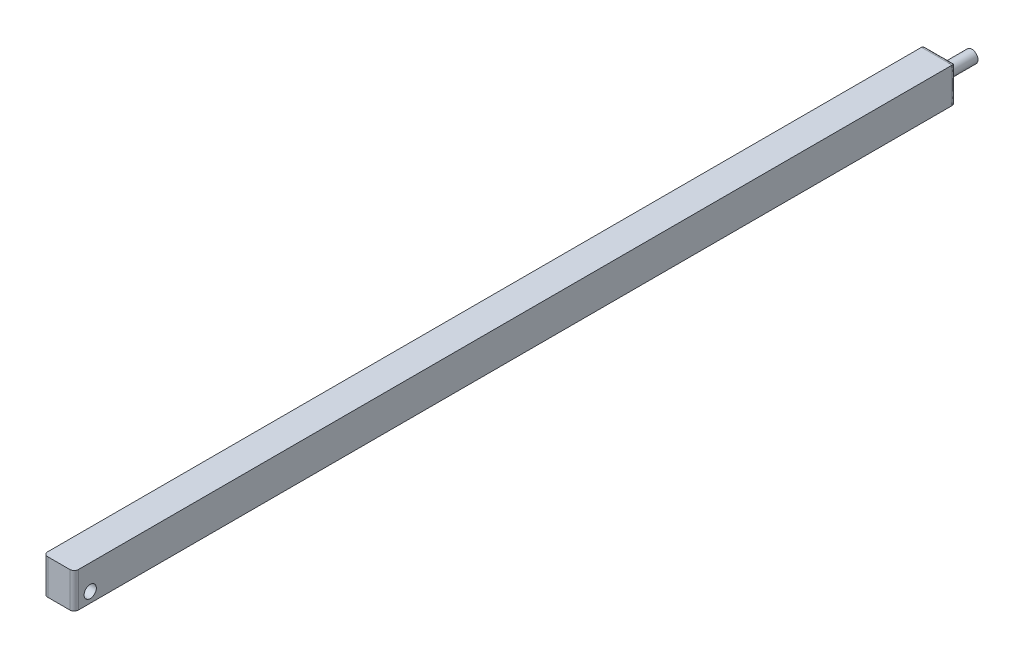
ISO-10303-21;
HEADER;
FILE_DESCRIPTION(('STEP AP214'),'2;1');
FILE_NAME('part.step','',(''),(''),'','','');
FILE_SCHEMA(('AUTOMOTIVE_DESIGN { 1 0 10303 214 1 1 1 1 }'));
ENDSEC;
DATA;
#1=APPLICATION_CONTEXT('core data for automotive mechanical design processes');
#2=APPLICATION_PROTOCOL_DEFINITION('international standard','automotive_design',2000,#1);
#3=PRODUCT_CONTEXT('',#1,'mechanical');
#4=PRODUCT('Part','Part','',(#3));
#5=PRODUCT_RELATED_PRODUCT_CATEGORY('part','',(#4));
#6=PRODUCT_DEFINITION_FORMATION('','',#4);
#7=PRODUCT_DEFINITION_CONTEXT('part definition',#1,'design');
#8=PRODUCT_DEFINITION('design','',#6,#7);
#9=PRODUCT_DEFINITION_SHAPE('','',#8);
#10=(LENGTH_UNIT() NAMED_UNIT(*) SI_UNIT(.MILLI.,.METRE.));
#11=(NAMED_UNIT(*) PLANE_ANGLE_UNIT() SI_UNIT($,.RADIAN.));
#12=(NAMED_UNIT(*) SI_UNIT($,.STERADIAN.) SOLID_ANGLE_UNIT());
#13=UNCERTAINTY_MEASURE_WITH_UNIT(LENGTH_MEASURE(1.E-05),#10,'distance_accuracy_value','');
#14=(GEOMETRIC_REPRESENTATION_CONTEXT(3) GLOBAL_UNCERTAINTY_ASSIGNED_CONTEXT((#13)) GLOBAL_UNIT_ASSIGNED_CONTEXT((#10,
#11,#12)) REPRESENTATION_CONTEXT('',''));
#15=CARTESIAN_POINT('',(0.,0.,0.));
#16=DIRECTION('',(0.,0.,1.));
#17=DIRECTION('',(1.,0.,0.));
#18=AXIS2_PLACEMENT_3D('',#15,#16,#17);
#19=CARTESIAN_POINT('',(0.,0.,1000.));
#20=DIRECTION('',(-1.,0.,0.));
#21=DIRECTION('',(0.,0.,1.));
#22=AXIS2_PLACEMENT_3D('',#19,#20,#21);
#23=PLANE('',#22);
#24=CARTESIAN_POINT('',(0.,11.6,981.7));
#25=DIRECTION('',(-1.,0.,0.));
#26=DIRECTION('',(0.,0.,1.));
#27=AXIS2_PLACEMENT_3D('',#24,#25,#26);
#28=CIRCLE('',#27,7.00000000000004);
#29=CARTESIAN_POINT('',(0.,11.6,974.7));
#30=VERTEX_POINT('',#29);
#31=EDGE_CURVE('E225',#30,#30,#28,.T.);
#32=ORIENTED_EDGE('',*,*,#31,.T.);
#33=EDGE_LOOP('',(#32));
#34=FACE_BOUND('',#33,.T.);
#35=DIRECTION('',(0.,0.,-1.));
#36=VECTOR('',#35,1.);
#37=CARTESIAN_POINT('',(0.,40.,1000.));
#38=LINE('',#37,#36);
#39=CARTESIAN_POINT('',(0.,40.,995.));
#40=VERTEX_POINT('',#39);
#41=CARTESIAN_POINT('',(0.,40.,0.));
#42=VERTEX_POINT('',#41);
#43=EDGE_CURVE('E221',#40,#42,#38,.T.);
#44=ORIENTED_EDGE('',*,*,#43,.F.);
#45=DIRECTION('',(0.,1.,0.));
#46=VECTOR('',#45,1.);
#47=CARTESIAN_POINT('',(0.,0.,995.));
#48=LINE('',#47,#46);
#49=CARTESIAN_POINT('',(0.,0.,995.));
#50=VERTEX_POINT('',#49);
#51=EDGE_CURVE('E12',#40,#50,#48,.F.);
#52=ORIENTED_EDGE('',*,*,#51,.T.);
#53=DIRECTION('',(0.,0.,-1.));
#54=VECTOR('',#53,1.);
#55=CARTESIAN_POINT('',(0.,0.,1000.));
#56=LINE('',#55,#54);
#57=CARTESIAN_POINT('',(0.,0.,0.));
#58=VERTEX_POINT('',#57);
#59=EDGE_CURVE('E210',#50,#58,#56,.T.);
#60=ORIENTED_EDGE('',*,*,#59,.T.);
#61=DIRECTION('',(0.,1.,0.));
#62=VECTOR('',#61,1.);
#63=CARTESIAN_POINT('',(0.,0.,0.));
#64=LINE('',#63,#62);
#65=EDGE_CURVE('E218',#58,#42,#64,.T.);
#66=ORIENTED_EDGE('',*,*,#65,.T.);
#67=EDGE_LOOP('',(#44,#52,#60,#66));
#68=FACE_BOUND('',#67,.T.);
#69=ADVANCED_FACE('F134',(#34,#68),#23,.F.);
#70=CARTESIAN_POINT('',(0.,40.,1000.));
#71=DIRECTION('',(0.,-1.,0.));
#72=DIRECTION('',(1.,0.,0.));
#73=AXIS2_PLACEMENT_3D('',#70,#71,#72);
#74=PLANE('',#73);
#75=DIRECTION('',(0.,0.,-1.));
#76=VECTOR('',#75,1.);
#77=CARTESIAN_POINT('',(-35.,40.,1000.));
#78=LINE('',#77,#76);
#79=CARTESIAN_POINT('',(-35.,40.,995.));
#80=VERTEX_POINT('',#79);
#81=CARTESIAN_POINT('',(-35.,40.,0.));
#82=VERTEX_POINT('',#81);
#83=EDGE_CURVE('E209',#80,#82,#78,.T.);
#84=ORIENTED_EDGE('',*,*,#83,.F.);
#85=CARTESIAN_POINT('',(-30.,40.,995.));
#86=DIRECTION('',(0.,-1.,0.));
#87=DIRECTION('',(1.,0.,0.));
#88=AXIS2_PLACEMENT_3D('',#85,#86,#87);
#89=CIRCLE('',#88,5.);
#90=CARTESIAN_POINT('',(-30.,40.,1000.));
#91=VERTEX_POINT('',#90);
#92=EDGE_CURVE('E145',#80,#91,#89,.F.);
#93=ORIENTED_EDGE('',*,*,#92,.T.);
#94=DIRECTION('',(-1.,0.,0.));
#95=VECTOR('',#94,1.);
#96=CARTESIAN_POINT('',(0.,40.,1000.));
#97=LINE('',#96,#95);
#98=CARTESIAN_POINT('',(-5.,40.,1000.));
#99=VERTEX_POINT('',#98);
#100=EDGE_CURVE('E186',#99,#91,#97,.T.);
#101=ORIENTED_EDGE('',*,*,#100,.F.);
#102=CARTESIAN_POINT('',(-5.,40.,995.));
#103=DIRECTION('',(0.,-1.,0.));
#104=DIRECTION('',(1.,0.,0.));
#105=AXIS2_PLACEMENT_3D('',#102,#103,#104);
#106=CIRCLE('',#105,5.);
#107=EDGE_CURVE('E154',#99,#40,#106,.F.);
#108=ORIENTED_EDGE('',*,*,#107,.T.);
#109=ORIENTED_EDGE('',*,*,#43,.T.);
#110=DIRECTION('',(1.,0.,0.));
#111=VECTOR('',#110,1.);
#112=CARTESIAN_POINT('',(0.,40.,0.));
#113=LINE('',#112,#111);
#114=EDGE_CURVE('E216',#42,#82,#113,.F.);
#115=ORIENTED_EDGE('',*,*,#114,.T.);
#116=EDGE_LOOP('',(#84,#93,#101,#108,#109,#115));
#117=FACE_BOUND('',#116,.T.);
#118=ADVANCED_FACE('F423',(#117),#74,.F.);
#119=CARTESIAN_POINT('',(-35.,0.,1000.));
#120=DIRECTION('',(1.,0.,0.));
#121=DIRECTION('',(0.,0.,-1.));
#122=AXIS2_PLACEMENT_3D('',#119,#120,#121);
#123=PLANE('',#122);
#124=CARTESIAN_POINT('',(-35.,11.6,981.7));
#125=DIRECTION('',(1.,0.,0.));
#126=DIRECTION('',(0.,0.,-1.));
#127=AXIS2_PLACEMENT_3D('',#124,#125,#126);
#128=CIRCLE('',#127,7.00000000000004);
#129=CARTESIAN_POINT('',(-35.,11.6,974.7));
#130=VERTEX_POINT('',#129);
#131=EDGE_CURVE('E412',#130,#130,#128,.T.);
#132=ORIENTED_EDGE('',*,*,#131,.T.);
#133=EDGE_LOOP('',(#132));
#134=FACE_BOUND('',#133,.T.);
#135=DIRECTION('',(0.,0.,-1.));
#136=VECTOR('',#135,1.);
#137=CARTESIAN_POINT('',(-35.,0.,1000.));
#138=LINE('',#137,#136);
#139=CARTESIAN_POINT('',(-35.,0.,995.));
#140=VERTEX_POINT('',#139);
#141=CARTESIAN_POINT('',(-35.,0.,0.));
#142=VERTEX_POINT('',#141);
#143=EDGE_CURVE('E202',#140,#142,#138,.T.);
#144=ORIENTED_EDGE('',*,*,#143,.F.);
#145=DIRECTION('',(0.,-1.,0.));
#146=VECTOR('',#145,1.);
#147=CARTESIAN_POINT('',(-35.,40.,995.));
#148=LINE('',#147,#146);
#149=EDGE_CURVE('E397',#140,#80,#148,.F.);
#150=ORIENTED_EDGE('',*,*,#149,.T.);
#151=ORIENTED_EDGE('',*,*,#83,.T.);
#152=DIRECTION('',(0.,1.,0.));
#153=VECTOR('',#152,1.);
#154=CARTESIAN_POINT('',(-35.,0.,0.));
#155=LINE('',#154,#153);
#156=EDGE_CURVE('E187',#82,#142,#155,.F.);
#157=ORIENTED_EDGE('',*,*,#156,.T.);
#158=EDGE_LOOP('',(#144,#150,#151,#157));
#159=FACE_BOUND('',#158,.T.);
#160=ADVANCED_FACE('F213',(#134,#159),#123,.F.);
#161=CARTESIAN_POINT('',(-35.,0.,1000.));
#162=DIRECTION('',(0.,1.,0.));
#163=DIRECTION('',(0.,0.,1.));
#164=AXIS2_PLACEMENT_3D('',#161,#162,#163);
#165=PLANE('',#164);
#166=DIRECTION('',(1.,0.,0.));
#167=VECTOR('',#166,1.);
#168=CARTESIAN_POINT('',(-35.,0.,1000.));
#169=LINE('',#168,#167);
#170=CARTESIAN_POINT('',(-30.,0.,1000.));
#171=VERTEX_POINT('',#170);
#172=CARTESIAN_POINT('',(-5.,0.,1000.));
#173=VERTEX_POINT('',#172);
#174=EDGE_CURVE('E390',#171,#173,#169,.T.);
#175=ORIENTED_EDGE('',*,*,#174,.F.);
#176=CARTESIAN_POINT('',(-30.,0.,995.));
#177=DIRECTION('',(0.,1.,0.));
#178=DIRECTION('',(0.,0.,1.));
#179=AXIS2_PLACEMENT_3D('',#176,#177,#178);
#180=CIRCLE('',#179,5.);
#181=EDGE_CURVE('E206',#171,#140,#180,.F.);
#182=ORIENTED_EDGE('',*,*,#181,.T.);
#183=ORIENTED_EDGE('',*,*,#143,.T.);
#184=DIRECTION('',(1.,0.,0.));
#185=VECTOR('',#184,1.);
#186=CARTESIAN_POINT('',(-35.,0.,0.));
#187=LINE('',#186,#185);
#188=EDGE_CURVE('E173',#142,#58,#187,.T.);
#189=ORIENTED_EDGE('',*,*,#188,.T.);
#190=ORIENTED_EDGE('',*,*,#59,.F.);
#191=CARTESIAN_POINT('',(-5.,0.,995.));
#192=DIRECTION('',(0.,1.,0.));
#193=DIRECTION('',(0.,0.,1.));
#194=AXIS2_PLACEMENT_3D('',#191,#192,#193);
#195=CIRCLE('',#194,5.);
#196=EDGE_CURVE('E388',#50,#173,#195,.F.);
#197=ORIENTED_EDGE('',*,*,#196,.T.);
#198=EDGE_LOOP('',(#175,#182,#183,#189,#190,#197));
#199=FACE_BOUND('',#198,.T.);
#200=ADVANCED_FACE('F204',(#199),#165,.F.);
#201=CARTESIAN_POINT('',(0.,0.,1000.));
#202=DIRECTION('',(0.,0.,1.));
#203=DIRECTION('',(1.,0.,0.));
#204=AXIS2_PLACEMENT_3D('',#201,#202,#203);
#205=PLANE('',#204);
#206=ORIENTED_EDGE('',*,*,#100,.T.);
#207=DIRECTION('',(0.,-1.,0.));
#208=VECTOR('',#207,1.);
#209=CARTESIAN_POINT('',(-30.,0.,1000.));
#210=LINE('',#209,#208);
#211=EDGE_CURVE('E395',#91,#171,#210,.T.);
#212=ORIENTED_EDGE('',*,*,#211,.T.);
#213=ORIENTED_EDGE('',*,*,#174,.T.);
#214=DIRECTION('',(0.,1.,0.));
#215=VECTOR('',#214,1.);
#216=CARTESIAN_POINT('',(-5.,40.,1000.));
#217=LINE('',#216,#215);
#218=EDGE_CURVE('E394',#173,#99,#217,.T.);
#219=ORIENTED_EDGE('',*,*,#218,.T.);
#220=EDGE_LOOP('',(#206,#212,#213,#219));
#221=FACE_BOUND('',#220,.T.);
#222=ADVANCED_FACE('F428',(#221),#205,.T.);
#223=CARTESIAN_POINT('',(-35.,11.6,981.7));
#224=DIRECTION('',(1.,0.,0.));
#225=DIRECTION('',(0.,0.,-1.));
#226=AXIS2_PLACEMENT_3D('',#223,#224,#225);
#227=CYLINDRICAL_SURFACE('',#226,7.00000000000004);
#228=CARTESIAN_POINT('',(-35.,11.6,974.7));
#229=CARTESIAN_POINT('',(-34.6354166666667,11.6,974.7));
#230=CARTESIAN_POINT('',(-34.2708333333333,11.6,974.7));
#231=CARTESIAN_POINT('',(-33.5416666666667,11.6,974.7));
#232=CARTESIAN_POINT('',(-33.1770833333333,11.6,974.7));
#233=CARTESIAN_POINT('',(-32.4479166666667,11.6,974.7));
#234=CARTESIAN_POINT('',(-32.0833333333333,11.6,974.7));
#235=CARTESIAN_POINT('',(-31.3541666666667,11.6,974.7));
#236=CARTESIAN_POINT('',(-30.9895833333333,11.6,974.7));
#237=CARTESIAN_POINT('',(-30.2604166666667,11.6,974.7));
#238=CARTESIAN_POINT('',(-29.8958333333333,11.6,974.7));
#239=CARTESIAN_POINT('',(-29.1666666666667,11.6,974.7));
#240=CARTESIAN_POINT('',(-28.8020833333333,11.6,974.7));
#241=CARTESIAN_POINT('',(-28.0729166666667,11.6,974.7));
#242=CARTESIAN_POINT('',(-27.7083333333333,11.6,974.7));
#243=CARTESIAN_POINT('',(-26.9791666666667,11.6,974.7));
#244=CARTESIAN_POINT('',(-26.6145833333333,11.6,974.7));
#245=CARTESIAN_POINT('',(-25.8854166666667,11.6,974.7));
#246=CARTESIAN_POINT('',(-25.5208333333333,11.6,974.7));
#247=CARTESIAN_POINT('',(-24.7916666666667,11.6,974.7));
#248=CARTESIAN_POINT('',(-24.4270833333333,11.6,974.7));
#249=CARTESIAN_POINT('',(-23.6979166666667,11.6,974.7));
#250=CARTESIAN_POINT('',(-23.3333333333333,11.6,974.7));
#251=CARTESIAN_POINT('',(-22.6041666666667,11.6,974.7));
#252=CARTESIAN_POINT('',(-22.2395833333333,11.6,974.7));
#253=CARTESIAN_POINT('',(-21.5104166666667,11.6,974.7));
#254=CARTESIAN_POINT('',(-21.1458333333333,11.6,974.7));
#255=CARTESIAN_POINT('',(-20.4166666666667,11.6,974.7));
#256=CARTESIAN_POINT('',(-20.0520833333333,11.6,974.7));
#257=CARTESIAN_POINT('',(-19.3229166666667,11.6,974.7));
#258=CARTESIAN_POINT('',(-18.9583333333333,11.6,974.7));
#259=CARTESIAN_POINT('',(-18.2291666666667,11.6,974.7));
#260=CARTESIAN_POINT('',(-17.8645833333333,11.6,974.7));
#261=CARTESIAN_POINT('',(-17.1354166666667,11.6,974.7));
#262=CARTESIAN_POINT('',(-16.7708333333333,11.6,974.7));
#263=CARTESIAN_POINT('',(-16.0416666666667,11.6,974.7));
#264=CARTESIAN_POINT('',(-15.6770833333333,11.6,974.7));
#265=CARTESIAN_POINT('',(-14.9479166666667,11.6,974.7));
#266=CARTESIAN_POINT('',(-14.5833333333333,11.6,974.7));
#267=CARTESIAN_POINT('',(-13.8541666666667,11.6,974.7));
#268=CARTESIAN_POINT('',(-13.4895833333333,11.6,974.7));
#269=CARTESIAN_POINT('',(-12.7604166666667,11.6,974.7));
#270=CARTESIAN_POINT('',(-12.3958333333333,11.6,974.7));
#271=CARTESIAN_POINT('',(-11.6666666666667,11.6,974.7));
#272=CARTESIAN_POINT('',(-11.3020833333333,11.6,974.7));
#273=CARTESIAN_POINT('',(-10.5729166666667,11.6,974.7));
#274=CARTESIAN_POINT('',(-10.2083333333333,11.6,974.7));
#275=CARTESIAN_POINT('',(-9.47916666666667,11.6,974.7));
#276=CARTESIAN_POINT('',(-9.11458333333333,11.6,974.7));
#277=CARTESIAN_POINT('',(-8.38541666666666,11.6,974.7));
#278=CARTESIAN_POINT('',(-8.02083333333333,11.6,974.7));
#279=CARTESIAN_POINT('',(-7.29166666666666,11.6,974.7));
#280=CARTESIAN_POINT('',(-6.92708333333333,11.6,974.7));
#281=CARTESIAN_POINT('',(-6.19791666666666,11.6,974.7));
#282=CARTESIAN_POINT('',(-5.83333333333333,11.6,974.7));
#283=CARTESIAN_POINT('',(-5.10416666666666,11.6,974.7));
#284=CARTESIAN_POINT('',(-4.73958333333333,11.6,974.7));
#285=CARTESIAN_POINT('',(-4.01041666666666,11.6,974.7));
#286=CARTESIAN_POINT('',(-3.64583333333333,11.6,974.7));
#287=CARTESIAN_POINT('',(-2.91666666666666,11.6,974.7));
#288=CARTESIAN_POINT('',(-2.55208333333333,11.6,974.7));
#289=CARTESIAN_POINT('',(-1.82291666666666,11.6,974.7));
#290=CARTESIAN_POINT('',(-1.45833333333333,11.6,974.7));
#291=CARTESIAN_POINT('',(-0.729166666666658,11.6,974.7));
#292=CARTESIAN_POINT('',(-0.364583333333325,11.6,974.7));
#293=CARTESIAN_POINT('',(0.,11.6,974.7));
#294=B_SPLINE_CURVE_WITH_KNOTS('',3,(#228,#229,#230,#231,#232,#233,#234,#235,#236,#237,#238,
#239,#240,#241,#242,#243,#244,#245,#246,#247,#248,#249,#250,#251,#252,#253,#254,#255,#256,#257,
#258,#259,#260,#261,#262,#263,#264,#265,#266,#267,#268,#269,#270,#271,#272,#273,#274,#275,#276,
#277,#278,#279,#280,#281,#282,#283,#284,#285,#286,#287,#288,#289,#290,#291,#292,#293),
.UNSPECIFIED.,.F.,.F.,(4,2,2,2,2,2,2,2,2,2,2,2,2,2,2,2,2,2,2,2,2,2,2,2,2,2,2,2,2,2,2,2,4),(0.,
1.09375,2.1875,3.28125,4.375,5.46875,6.5625,7.65625,8.75,9.84375,10.9375,12.03125,13.125,
14.21875,15.3125,16.40625,17.5,18.59375,19.6875,20.78125,21.875,22.96875,24.0625,25.15625,26.25,
27.34375,28.4375,29.53125,30.625,31.71875,32.8125,33.90625,35.),.UNSPECIFIED.);
#295=EDGE_CURVE('BSEAM326',#130,#30,#294,.T.);
#296=ORIENTED_EDGE('',*,*,#131,.F.);
#297=ORIENTED_EDGE('',*,*,#31,.F.);
#298=ORIENTED_EDGE('',*,*,#295,.T.);
#299=ORIENTED_EDGE('',*,*,#295,.F.);
#300=EDGE_LOOP('',(#296,#298,#297,#299));
#301=FACE_BOUND('',#300,.T.);
#302=ADVANCED_FACE('F326',(#301),#227,.F.);
#303=CARTESIAN_POINT('',(-30.,0.,995.));
#304=DIRECTION('',(0.,1.,0.));
#305=DIRECTION('',(0.,0.,1.));
#306=AXIS2_PLACEMENT_3D('',#303,#304,#305);
#307=CYLINDRICAL_SURFACE('',#306,5.);
#308=ORIENTED_EDGE('',*,*,#92,.F.);
#309=ORIENTED_EDGE('',*,*,#149,.F.);
#310=ORIENTED_EDGE('',*,*,#181,.F.);
#311=ORIENTED_EDGE('',*,*,#211,.F.);
#312=EDGE_LOOP('',(#308,#309,#310,#311));
#313=FACE_BOUND('',#312,.T.);
#314=ADVANCED_FACE('F427',(#313),#307,.T.);
#315=CARTESIAN_POINT('',(-5.,0.,995.));
#316=DIRECTION('',(0.,-1.,0.));
#317=DIRECTION('',(0.,0.,-1.));
#318=AXIS2_PLACEMENT_3D('',#315,#316,#317);
#319=CYLINDRICAL_SURFACE('',#318,5.);
#320=ORIENTED_EDGE('',*,*,#196,.F.);
#321=ORIENTED_EDGE('',*,*,#51,.F.);
#322=ORIENTED_EDGE('',*,*,#107,.F.);
#323=ORIENTED_EDGE('',*,*,#218,.F.);
#324=EDGE_LOOP('',(#320,#321,#322,#323));
#325=FACE_BOUND('',#324,.T.);
#326=ADVANCED_FACE('F136',(#325),#319,.T.);
#327=CARTESIAN_POINT('',(0.,40.,0.));
#328=CARTESIAN_POINT('',(0.,40.,-7.32723152625637));
#329=CARTESIAN_POINT('',(-12.8904677449204,25.2680368629481,-2.67276847374363));
#330=CARTESIAN_POINT('',(-12.8904677449204,25.2680368629481,-10.));
#331=CARTESIAN_POINT('',(0.,38.3333333333333,0.));
#332=CARTESIAN_POINT('',(0.,38.3333333333333,-6.97295062913033));
#333=CARTESIAN_POINT('',(-12.5107143200965,24.9357526162273,-3.02704937086967));
#334=CARTESIAN_POINT('',(-12.5107143200965,24.9357526162273,-10.));
#335=CARTESIAN_POINT('',(0.,35.,0.));
#336=CARTESIAN_POINT('',(0.,35.,-6.26438883487824));
#337=CARTESIAN_POINT('',(-11.8321524271576,24.1980583791587,-3.73561116512174));
#338=CARTESIAN_POINT('',(-11.8321524271576,24.1980583791587,-9.99999999999998));
#339=CARTESIAN_POINT('',(0.,30.,0.));
#340=CARTESIAN_POINT('',(0.,30.,-5.47650505491216));
#341=CARTESIAN_POINT('',(-11.0781345571214,22.9125989379517,-4.52349494508785));
#342=CARTESIAN_POINT('',(-11.0781345571214,22.9125989379517,-10.));
#343=CARTESIAN_POINT('',(0.,25.,0.));
#344=CARTESIAN_POINT('',(0.,25.,-4.9536516340868));
#345=CARTESIAN_POINT('',(-10.6089317557031,21.5043365407556,-5.0463483659132));
#346=CARTESIAN_POINT('',(-10.6089317557031,21.5043365407556,-9.99999999999999));
#347=CARTESIAN_POINT('',(0.,20.,0.));
#348=CARTESIAN_POINT('',(0.,20.,-4.7731741829566));
#349=CARTESIAN_POINT('',(-10.4455341221484,20.,-5.22682581704341));
#350=CARTESIAN_POINT('',(-10.4455341221484,20.,-10.));
#351=CARTESIAN_POINT('',(0.,15.,0.));
#352=CARTESIAN_POINT('',(0.,15.,-4.95365163408681));
#353=CARTESIAN_POINT('',(-10.6089317557031,18.4956634592444,-5.04634836591319));
#354=CARTESIAN_POINT('',(-10.6089317557031,18.4956634592444,-9.99999999999999));
#355=CARTESIAN_POINT('',(0.,10.,0.));
#356=CARTESIAN_POINT('',(0.,10.,-5.47650505491215));
#357=CARTESIAN_POINT('',(-11.0781345571214,17.0874010620483,-4.52349494508786));
#358=CARTESIAN_POINT('',(-11.0781345571214,17.0874010620483,-10.));
#359=CARTESIAN_POINT('',(0.,5.,0.));
#360=CARTESIAN_POINT('',(0.,5.,-6.26438883487825));
#361=CARTESIAN_POINT('',(-11.8321524271576,15.8019416208414,-3.73561116512174));
#362=CARTESIAN_POINT('',(-11.8321524271576,15.8019416208414,-9.99999999999999));
#363=CARTESIAN_POINT('',(0.,1.66666666666667,0.));
#364=CARTESIAN_POINT('',(0.,1.66666666666667,-6.97295062913033));
#365=CARTESIAN_POINT('',(-12.5107143200965,15.0642473837727,-3.02704937086967));
#366=CARTESIAN_POINT('',(-12.5107143200965,15.0642473837727,-10.));
#367=CARTESIAN_POINT('',(0.,0.,0.));
#368=CARTESIAN_POINT('',(0.,0.,-7.32723152625637));
#369=CARTESIAN_POINT('',(-12.8904677449204,14.7319631370519,-2.67276847374363));
#370=CARTESIAN_POINT('',(-12.8904677449204,14.7319631370519,-10.));
#371=B_SPLINE_SURFACE_WITH_KNOTS('',3,3,((#327,#328,#329,#330),(#331,#332,#333,#334),(#335,#336,
#337,#338),(#339,#340,#341,#342),(#343,#344,#345,#346),(#347,#348,#349,#350),(#351,#352,#353,
#354),(#355,#356,#357,#358),(#359,#360,#361,#362),(#363,#364,#365,#366),(#367,#368,#369,#370)),
.UNSPECIFIED.,.F.,.F.,.F.,(4,1,1,1,1,1,1,1,4),(4,4),(0.,0.125,0.25,0.375,0.5,0.625,0.75,0.875,
1.),(0.,1.),.UNSPECIFIED.);
#372=CARTESIAN_POINT('',(0.,0.,0.));
#373=CARTESIAN_POINT('',(0.,0.,-7.32723152625637));
#374=CARTESIAN_POINT('',(-12.8904677449204,14.7319631370519,-2.67276847374363));
#375=CARTESIAN_POINT('',(-12.8904677449204,14.7319631370519,-10.));
#376=B_SPLINE_CURVE_WITH_KNOTS('',3,(#372,#373,#374,#375),.UNSPECIFIED.,.F.,.F.,(4,4),(0.,1.),.UNSPECIFIED.);
#377=CARTESIAN_POINT('',(-12.8903405716613,14.7318186158143,-10.));
#378=VERTEX_POINT('',#377);
#379=EDGE_CURVE('E181',#58,#378,#376,.T.);
#380=CARTESIAN_POINT('',(-17.5,20.,-10.));
#381=DIRECTION('',(0.,0.,-1.));
#382=DIRECTION('',(-1.,0.,0.));
#383=AXIS2_PLACEMENT_3D('',#380,#381,#382);
#384=CIRCLE('',#383,7.);
#385=CARTESIAN_POINT('',(-12.890322058595,25.2682023984373,-10.));
#386=VERTEX_POINT('',#385);
#387=EDGE_CURVE('E138',#386,#378,#384,.T.);
#388=CARTESIAN_POINT('',(0.,40.,0.));
#389=CARTESIAN_POINT('',(0.,40.,-7.32723152625637));
#390=CARTESIAN_POINT('',(-12.8904677449204,25.2680368629481,-2.67276847374363));
#391=CARTESIAN_POINT('',(-12.8904677449204,25.2680368629481,-10.));
#392=B_SPLINE_CURVE_WITH_KNOTS('',3,(#388,#389,#390,#391),.UNSPECIFIED.,.F.,.F.,(4,4),(0.,1.),.UNSPECIFIED.);
#393=EDGE_CURVE('E241',#386,#42,#392,.F.);
#394=ORIENTED_EDGE('',*,*,#65,.F.);
#395=ORIENTED_EDGE('',*,*,#379,.T.);
#396=ORIENTED_EDGE('',*,*,#387,.F.);
#397=ORIENTED_EDGE('',*,*,#393,.T.);
#398=EDGE_LOOP('',(#394,#395,#396,#397));
#399=FACE_BOUND('',#398,.T.);
#400=ADVANCED_FACE('F272',(#399),#371,.T.);
#401=CARTESIAN_POINT('',(0.,0.,0.));
#402=CARTESIAN_POINT('',(0.,0.,-7.32723152625637));
#403=CARTESIAN_POINT('',(-12.8904677449204,14.7319631370519,-2.67276847374363));
#404=CARTESIAN_POINT('',(-12.8904677449204,14.7319631370519,-10.));
#405=CARTESIAN_POINT('',(-11.6666666666667,0.,0.));
#406=CARTESIAN_POINT('',(-11.6666666666667,0.,-7.32723152625637));
#407=CARTESIAN_POINT('',(-15.5283942195916,12.4237774717146,-2.67276847374363));
#408=CARTESIAN_POINT('',(-15.5283942195916,12.4237774717146,-10.));
#409=CARTESIAN_POINT('',(-23.3333333333333,0.,0.));
#410=CARTESIAN_POINT('',(-23.3333333333333,0.,-7.32723152625637));
#411=CARTESIAN_POINT('',(-19.4716057804084,12.4237774717146,-2.67276847374363));
#412=CARTESIAN_POINT('',(-19.4716057804084,12.4237774717146,-10.));
#413=CARTESIAN_POINT('',(-35.,0.,0.));
#414=CARTESIAN_POINT('',(-35.,0.,-7.32723152625637));
#415=CARTESIAN_POINT('',(-22.1095322550796,14.7319631370519,-2.67276847374363));
#416=CARTESIAN_POINT('',(-22.1095322550796,14.7319631370519,-10.));
#417=B_SPLINE_SURFACE_WITH_KNOTS('',3,3,((#401,#402,#403,#404),(#405,#406,#407,#408),(#409,#410,
#411,#412),(#413,#414,#415,#416)),.UNSPECIFIED.,.F.,.F.,.F.,(4,4),(4,4),(0.,1.),(0.,1.),.UNSPECIFIED.);
#418=CARTESIAN_POINT('',(-35.,0.,0.));
#419=CARTESIAN_POINT('',(-35.,0.,-7.32723152625637));
#420=CARTESIAN_POINT('',(-22.1095322550796,14.7319631370519,-2.67276847374363));
#421=CARTESIAN_POINT('',(-22.1095322550796,14.7319631370519,-10.));
#422=B_SPLINE_CURVE_WITH_KNOTS('',3,(#418,#419,#420,#421),.UNSPECIFIED.,.F.,.F.,(4,4),(0.,1.),.UNSPECIFIED.);
#423=CARTESIAN_POINT('',(-22.1096779415556,14.7317976013917,-10.));
#424=VERTEX_POINT('',#423);
#425=EDGE_CURVE('E178',#142,#424,#422,.T.);
#426=EDGE_CURVE('E228',#378,#424,#384,.T.);
#427=ORIENTED_EDGE('',*,*,#188,.F.);
#428=ORIENTED_EDGE('',*,*,#425,.T.);
#429=ORIENTED_EDGE('',*,*,#426,.F.);
#430=ORIENTED_EDGE('',*,*,#379,.F.);
#431=EDGE_LOOP('',(#427,#428,#429,#430));
#432=FACE_BOUND('',#431,.T.);
#433=ADVANCED_FACE('F175',(#432),#417,.T.);
#434=CARTESIAN_POINT('',(-35.,40.,0.));
#435=CARTESIAN_POINT('',(-35.,40.,-7.32723152625637));
#436=CARTESIAN_POINT('',(-22.1095322550796,25.2680368629481,-2.67276847374363));
#437=CARTESIAN_POINT('',(-22.1095322550796,25.2680368629481,-10.));
#438=CARTESIAN_POINT('',(-23.3333333333333,40.,0.));
#439=CARTESIAN_POINT('',(-23.3333333333333,40.,-7.32723152625637));
#440=CARTESIAN_POINT('',(-19.4716057804084,27.5762225282854,-2.67276847374363));
#441=CARTESIAN_POINT('',(-19.4716057804084,27.5762225282854,-10.));
#442=CARTESIAN_POINT('',(-11.6666666666667,40.,0.));
#443=CARTESIAN_POINT('',(-11.6666666666667,40.,-7.32723152625637));
#444=CARTESIAN_POINT('',(-15.5283942195916,27.5762225282854,-2.67276847374363));
#445=CARTESIAN_POINT('',(-15.5283942195916,27.5762225282854,-10.));
#446=CARTESIAN_POINT('',(0.,40.,0.));
#447=CARTESIAN_POINT('',(0.,40.,-7.32723152625637));
#448=CARTESIAN_POINT('',(-12.8904677449204,25.2680368629481,-2.67276847374363));
#449=CARTESIAN_POINT('',(-12.8904677449204,25.2680368629481,-10.));
#450=B_SPLINE_SURFACE_WITH_KNOTS('',3,3,((#434,#435,#436,#437),(#438,#439,#440,#441),(#442,#443,
#444,#445),(#446,#447,#448,#449)),.UNSPECIFIED.,.F.,.F.,.F.,(4,4),(4,4),(0.,1.),(0.,1.),.UNSPECIFIED.);
#451=CARTESIAN_POINT('',(-22.1096594282141,25.2681813840441,-10.));
#452=VERTEX_POINT('',#451);
#453=EDGE_CURVE('E239',#452,#386,#384,.T.);
#454=CARTESIAN_POINT('',(-35.,40.,0.));
#455=CARTESIAN_POINT('',(-35.,40.,-7.32723152625637));
#456=CARTESIAN_POINT('',(-22.1095322550796,25.2680368629481,-2.67276847374363));
#457=CARTESIAN_POINT('',(-22.1095322550796,25.2680368629481,-10.));
#458=B_SPLINE_CURVE_WITH_KNOTS('',3,(#454,#455,#456,#457),.UNSPECIFIED.,.F.,.F.,(4,4),(0.,1.),.UNSPECIFIED.);
#459=EDGE_CURVE('E198',#82,#452,#458,.T.);
#460=ORIENTED_EDGE('',*,*,#114,.F.);
#461=ORIENTED_EDGE('',*,*,#393,.F.);
#462=ORIENTED_EDGE('',*,*,#453,.F.);
#463=ORIENTED_EDGE('',*,*,#459,.F.);
#464=EDGE_LOOP('',(#460,#461,#462,#463));
#465=FACE_BOUND('',#464,.T.);
#466=ADVANCED_FACE('F305',(#465),#450,.T.);
#467=CARTESIAN_POINT('',(-35.,0.,0.));
#468=CARTESIAN_POINT('',(-35.,0.,-7.32723152625637));
#469=CARTESIAN_POINT('',(-22.1095322550796,14.7319631370519,-2.67276847374363));
#470=CARTESIAN_POINT('',(-22.1095322550796,14.7319631370519,-10.));
#471=CARTESIAN_POINT('',(-35.,1.66666666666667,0.));
#472=CARTESIAN_POINT('',(-35.,1.66666666666667,-6.97295062913033));
#473=CARTESIAN_POINT('',(-22.4892856799035,15.0642473837727,-3.02704937086967));
#474=CARTESIAN_POINT('',(-22.4892856799035,15.0642473837727,-10.));
#475=CARTESIAN_POINT('',(-35.,5.,0.));
#476=CARTESIAN_POINT('',(-35.,5.,-6.26438883487824));
#477=CARTESIAN_POINT('',(-23.1678475728424,15.8019416208414,-3.73561116512174));
#478=CARTESIAN_POINT('',(-23.1678475728424,15.8019416208414,-9.99999999999998));
#479=CARTESIAN_POINT('',(-35.,10.,0.));
#480=CARTESIAN_POINT('',(-35.,10.,-5.47650505491217));
#481=CARTESIAN_POINT('',(-23.9218654428786,17.0874010620483,-4.52349494508785));
#482=CARTESIAN_POINT('',(-23.9218654428786,17.0874010620483,-10.));
#483=CARTESIAN_POINT('',(-35.,15.,0.));
#484=CARTESIAN_POINT('',(-35.,15.,-4.9536516340868));
#485=CARTESIAN_POINT('',(-24.3910682442969,18.4956634592444,-5.0463483659132));
#486=CARTESIAN_POINT('',(-24.3910682442969,18.4956634592444,-9.99999999999999));
#487=CARTESIAN_POINT('',(-35.,20.,0.));
#488=CARTESIAN_POINT('',(-35.,20.,-4.7731741829566));
#489=CARTESIAN_POINT('',(-24.5544658778516,20.,-5.22682581704341));
#490=CARTESIAN_POINT('',(-24.5544658778516,20.,-10.));
#491=CARTESIAN_POINT('',(-35.,25.,0.));
#492=CARTESIAN_POINT('',(-35.,25.,-4.9536516340868));
#493=CARTESIAN_POINT('',(-24.3910682442969,21.5043365407556,-5.04634836591319));
#494=CARTESIAN_POINT('',(-24.3910682442969,21.5043365407556,-9.99999999999999));
#495=CARTESIAN_POINT('',(-35.,30.,0.));
#496=CARTESIAN_POINT('',(-35.,30.,-5.47650505491216));
#497=CARTESIAN_POINT('',(-23.9218654428786,22.9125989379517,-4.52349494508784));
#498=CARTESIAN_POINT('',(-23.9218654428786,22.9125989379517,-10.));
#499=CARTESIAN_POINT('',(-35.,35.,0.));
#500=CARTESIAN_POINT('',(-35.,35.,-6.26438883487825));
#501=CARTESIAN_POINT('',(-23.1678475728424,24.1980583791586,-3.73561116512174));
#502=CARTESIAN_POINT('',(-23.1678475728424,24.1980583791586,-9.99999999999999));
#503=CARTESIAN_POINT('',(-35.,38.3333333333333,0.));
#504=CARTESIAN_POINT('',(-35.,38.3333333333333,-6.97295062913033));
#505=CARTESIAN_POINT('',(-22.4892856799035,24.9357526162273,-3.02704937086967));
#506=CARTESIAN_POINT('',(-22.4892856799035,24.9357526162273,-10.));
#507=CARTESIAN_POINT('',(-35.,40.,0.));
#508=CARTESIAN_POINT('',(-35.,40.,-7.32723152625637));
#509=CARTESIAN_POINT('',(-22.1095322550796,25.2680368629481,-2.67276847374363));
#510=CARTESIAN_POINT('',(-22.1095322550796,25.2680368629481,-10.));
#511=B_SPLINE_SURFACE_WITH_KNOTS('',3,3,((#467,#468,#469,#470),(#471,#472,#473,#474),(#475,#476,
#477,#478),(#479,#480,#481,#482),(#483,#484,#485,#486),(#487,#488,#489,#490),(#491,#492,#493,
#494),(#495,#496,#497,#498),(#499,#500,#501,#502),(#503,#504,#505,#506),(#507,#508,#509,#510)),
.UNSPECIFIED.,.F.,.F.,.F.,(4,1,1,1,1,1,1,1,4),(4,4),(0.,0.125,0.25,0.375,0.5,0.625,0.75,0.875,
1.),(0.,1.),.UNSPECIFIED.);
#512=EDGE_CURVE('E196',#424,#452,#384,.T.);
#513=ORIENTED_EDGE('',*,*,#156,.F.);
#514=ORIENTED_EDGE('',*,*,#459,.T.);
#515=ORIENTED_EDGE('',*,*,#512,.F.);
#516=ORIENTED_EDGE('',*,*,#425,.F.);
#517=EDGE_LOOP('',(#513,#514,#515,#516));
#518=FACE_BOUND('',#517,.T.);
#519=ADVANCED_FACE('F191',(#518),#511,.T.);
#520=CARTESIAN_POINT('',(-17.5,20.,-40.));
#521=DIRECTION('',(0.,0.,1.));
#522=DIRECTION('',(1.,0.,0.));
#523=AXIS2_PLACEMENT_3D('',#520,#521,#522);
#524=CYLINDRICAL_SURFACE('',#523,7.);
#525=ORIENTED_EDGE('',*,*,#453,.T.);
#526=ORIENTED_EDGE('',*,*,#387,.T.);
#527=ORIENTED_EDGE('',*,*,#426,.T.);
#528=ORIENTED_EDGE('',*,*,#512,.T.);
#529=EDGE_LOOP('',(#525,#526,#527,#528));
#530=FACE_BOUND('',#529,.T.);
#531=CARTESIAN_POINT('',(-17.5,20.,-40.));
#532=DIRECTION('',(0.,0.,-1.));
#533=DIRECTION('',(-1.,0.,0.));
#534=AXIS2_PLACEMENT_3D('',#531,#532,#533);
#535=CIRCLE('',#534,7.);
#536=CARTESIAN_POINT('',(-24.5,20.,-40.));
#537=VERTEX_POINT('',#536);
#538=EDGE_CURVE('E229',#537,#537,#535,.T.);
#539=ORIENTED_EDGE('',*,*,#538,.F.);
#540=EDGE_LOOP('',(#539));
#541=FACE_BOUND('',#540,.T.);
#542=ADVANCED_FACE('F251',(#530,#541),#524,.T.);
#543=CARTESIAN_POINT('',(-17.5,20.,-40.));
#544=DIRECTION('',(0.,0.,-1.));
#545=DIRECTION('',(-1.,0.,0.));
#546=AXIS2_PLACEMENT_3D('',#543,#544,#545);
#547=PLANE('',#546);
#548=ORIENTED_EDGE('',*,*,#538,.T.);
#549=EDGE_LOOP('',(#548));
#550=FACE_BOUND('',#549,.T.);
#551=ADVANCED_FACE('F271',(#550),#547,.T.);
#552=CLOSED_SHELL('',(#69,#118,#160,#200,#222,#302,#314,#326,#400,#433,#466,#519,#542,#551));
#553=MANIFOLD_SOLID_BREP('B2',#552);
#554=ADVANCED_BREP_SHAPE_REPRESENTATION('',(#18,#553),#14);
#555=SHAPE_DEFINITION_REPRESENTATION(#9,#554);
ENDSEC;
END-ISO-10303-21;
